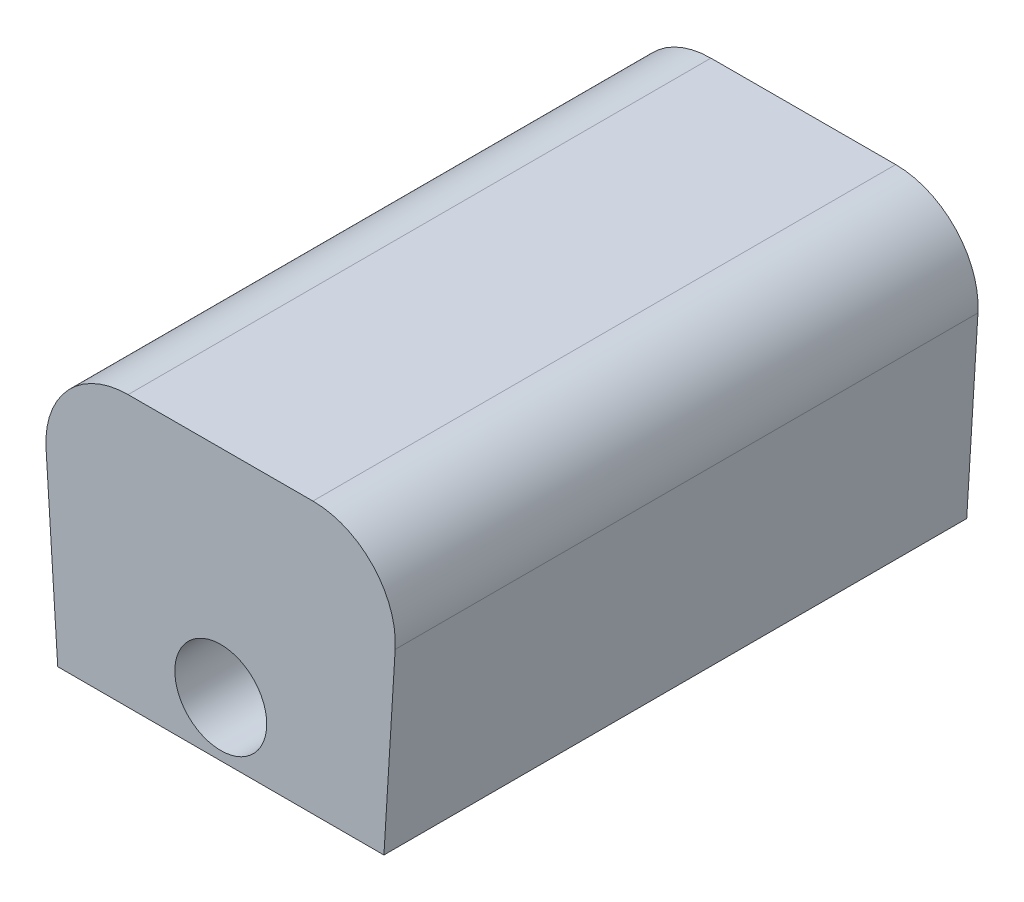
ISO-10303-21;
HEADER;
FILE_DESCRIPTION(('STEP AP214'),'2;1');
FILE_NAME('part.step','',(''),(''),'','','');
FILE_SCHEMA(('AUTOMOTIVE_DESIGN { 1 0 10303 214 1 1 1 1 }'));
ENDSEC;
DATA;
#1=APPLICATION_CONTEXT('core data for automotive mechanical design processes');
#2=APPLICATION_PROTOCOL_DEFINITION('international standard','automotive_design',2000,#1);
#3=PRODUCT_CONTEXT('',#1,'mechanical');
#4=PRODUCT('Part','Part','',(#3));
#5=PRODUCT_RELATED_PRODUCT_CATEGORY('part','',(#4));
#6=PRODUCT_DEFINITION_FORMATION('','',#4);
#7=PRODUCT_DEFINITION_CONTEXT('part definition',#1,'design');
#8=PRODUCT_DEFINITION('design','',#6,#7);
#9=PRODUCT_DEFINITION_SHAPE('','',#8);
#10=(LENGTH_UNIT() NAMED_UNIT(*) SI_UNIT(.MILLI.,.METRE.));
#11=(NAMED_UNIT(*) PLANE_ANGLE_UNIT() SI_UNIT($,.RADIAN.));
#12=(NAMED_UNIT(*) SI_UNIT($,.STERADIAN.) SOLID_ANGLE_UNIT());
#13=UNCERTAINTY_MEASURE_WITH_UNIT(LENGTH_MEASURE(1.E-05),#10,'distance_accuracy_value','');
#14=(GEOMETRIC_REPRESENTATION_CONTEXT(3) GLOBAL_UNCERTAINTY_ASSIGNED_CONTEXT((#13)) GLOBAL_UNIT_ASSIGNED_CONTEXT((#10,
#11,#12)) REPRESENTATION_CONTEXT('',''));
#15=CARTESIAN_POINT('',(0.,0.,0.));
#16=DIRECTION('',(0.,0.,1.));
#17=DIRECTION('',(1.,0.,0.));
#18=AXIS2_PLACEMENT_3D('',#15,#16,#17);
#19=CARTESIAN_POINT('',(-20.5939013463373,13.0074524571815,26.9748));
#20=DIRECTION('',(0.,0.,1.));
#21=DIRECTION('',(1.,0.,0.));
#22=AXIS2_PLACEMENT_3D('',#19,#20,#21);
#23=PLANE('',#22);
#24=DIRECTION('',(-1.,0.,0.));
#25=VECTOR('',#24,1.);
#26=CARTESIAN_POINT('',(-34.6351943560014,32.0560734353228,26.9748));
#27=LINE('',#26,#25);
#28=CARTESIAN_POINT('',(-13.0693880709597,32.0560734353228,26.9748));
#29=VERTEX_POINT('',#28);
#30=CARTESIAN_POINT('',(-28.1669222652994,32.0560734353228,26.9748));
#31=VERTEX_POINT('',#30);
#32=EDGE_CURVE('E55',#29,#31,#27,.T.);
#33=ORIENTED_EDGE('',*,*,#32,.F.);
#34=DIRECTION('',(0.0611381739078937,0.998129312109011,0.));
#35=VECTOR('',#34,1.);
#36=CARTESIAN_POINT('',(-14.2437428066184,12.8837984138138,26.9748));
#37=LINE('',#36,#35);
#38=CARTESIAN_POINT('',(-12.5485319114021,40.5594644759219,26.9748));
#39=VERTEX_POINT('',#38);
#40=EDGE_CURVE('E90',#29,#39,#37,.T.);
#41=ORIENTED_EDGE('',*,*,#40,.T.);
#42=CARTESIAN_POINT('',(-16.3514045905375,40.792400918511,26.9748));
#43=DIRECTION('',(0.,0.,1.));
#44=DIRECTION('',(1.,0.,0.));
#45=AXIS2_PLACEMENT_3D('',#42,#43,#44);
#46=CIRCLE('',#45,3.81);
#47=CARTESIAN_POINT('',(-16.3561384535796,44.6023979776359,26.9748));
#48=VERTEX_POINT('',#47);
#49=EDGE_CURVE('E116',#39,#48,#46,.T.);
#50=ORIENTED_EDGE('',*,*,#49,.T.);
#51=DIRECTION('',(-0.999999228116782,-0.00124248373809945,0.));
#52=VECTOR('',#51,1.);
#53=CARTESIAN_POINT('',(-16.3561384535796,44.6023979776359,26.9748));
#54=LINE('',#53,#52);
#55=CARTESIAN_POINT('',(-24.910163506296,44.5917697324088,26.9748));
#56=VERTEX_POINT('',#55);
#57=EDGE_CURVE('E121',#48,#56,#54,.T.);
#58=ORIENTED_EDGE('',*,*,#57,.T.);
#59=CARTESIAN_POINT('',(-24.9054296432539,40.7817726732839,26.9748));
#60=DIRECTION('',(0.,0.,1.));
#61=DIRECTION('',(1.,0.,0.));
#62=AXIS2_PLACEMENT_3D('',#59,#60,#61);
#63=CIRCLE('',#62,3.81);
#64=CARTESIAN_POINT('',(-28.7077117418623,40.539386942264,26.9748));
#65=VERTEX_POINT('',#64);
#66=EDGE_CURVE('E63',#56,#65,#63,.T.);
#67=ORIENTED_EDGE('',*,*,#66,.T.);
#68=DIRECTION('',(0.0636183021049628,-0.997974304096695,0.));
#69=VECTOR('',#68,1.);
#70=CARTESIAN_POINT('',(-28.7077117418623,40.539386942264,26.9748));
#71=LINE('',#70,#69);
#72=EDGE_CURVE('E110',#65,#31,#71,.T.);
#73=ORIENTED_EDGE('',*,*,#72,.T.);
#74=EDGE_LOOP('',(#33,#41,#50,#58,#67,#73));
#75=FACE_BOUND('',#74,.T.);
#76=CARTESIAN_POINT('',(-20.6207248775353,34.5960734353228,26.9748));
#77=DIRECTION('',(0.,0.,1.));
#78=DIRECTION('',(1.,0.,0.));
#79=AXIS2_PLACEMENT_3D('',#76,#77,#78);
#80=CIRCLE('',#79,2.127);
#81=CARTESIAN_POINT('',(-18.4937248775353,34.5960734353228,26.9748));
#82=VERTEX_POINT('',#81);
#83=EDGE_CURVE('E139',#82,#82,#80,.T.);
#84=ORIENTED_EDGE('',*,*,#83,.F.);
#85=EDGE_LOOP('',(#84));
#86=FACE_BOUND('',#85,.T.);
#87=ADVANCED_FACE('F39',(#75,#86),#23,.T.);
#88=CARTESIAN_POINT('',(-20.5939013463373,13.0074524571815,0.));
#89=DIRECTION('',(0.,0.,1.));
#90=DIRECTION('',(1.,0.,0.));
#91=AXIS2_PLACEMENT_3D('',#88,#89,#90);
#92=PLANE('',#91);
#93=DIRECTION('',(0.0611381739078937,0.998129312109011,0.));
#94=VECTOR('',#93,1.);
#95=CARTESIAN_POINT('',(-14.2437428066184,12.8837984138138,0.));
#96=LINE('',#95,#94);
#97=CARTESIAN_POINT('',(-13.0693880709597,32.0560734353228,0.));
#98=VERTEX_POINT('',#97);
#99=CARTESIAN_POINT('',(-12.5485319114021,40.5594644759219,0.));
#100=VERTEX_POINT('',#99);
#101=EDGE_CURVE('E135',#98,#100,#96,.T.);
#102=ORIENTED_EDGE('',*,*,#101,.F.);
#103=DIRECTION('',(-1.,0.,0.));
#104=VECTOR('',#103,1.);
#105=CARTESIAN_POINT('',(-34.6351943560014,32.0560734353228,0.));
#106=LINE('',#105,#104);
#107=CARTESIAN_POINT('',(-28.1669222652994,32.0560734353228,0.));
#108=VERTEX_POINT('',#107);
#109=EDGE_CURVE('E102',#98,#108,#106,.T.);
#110=ORIENTED_EDGE('',*,*,#109,.T.);
#111=DIRECTION('',(0.0636183021049628,-0.997974304096695,0.));
#112=VECTOR('',#111,1.);
#113=CARTESIAN_POINT('',(-28.7077117418623,40.539386942264,0.));
#114=LINE('',#113,#112);
#115=CARTESIAN_POINT('',(-28.7077117418623,40.539386942264,0.));
#116=VERTEX_POINT('',#115);
#117=EDGE_CURVE('E117',#116,#108,#114,.T.);
#118=ORIENTED_EDGE('',*,*,#117,.F.);
#119=CARTESIAN_POINT('',(-24.9054296432539,40.7817726732839,0.));
#120=DIRECTION('',(0.,0.,1.));
#121=DIRECTION('',(1.,0.,0.));
#122=AXIS2_PLACEMENT_3D('',#119,#120,#121);
#123=CIRCLE('',#122,3.81);
#124=CARTESIAN_POINT('',(-24.910163506296,44.5917697324088,0.));
#125=VERTEX_POINT('',#124);
#126=EDGE_CURVE('E84',#125,#116,#123,.T.);
#127=ORIENTED_EDGE('',*,*,#126,.F.);
#128=DIRECTION('',(-0.999999228116782,-0.00124248373809945,0.));
#129=VECTOR('',#128,1.);
#130=CARTESIAN_POINT('',(-16.3561384535796,44.6023979776359,0.));
#131=LINE('',#130,#129);
#132=CARTESIAN_POINT('',(-16.3561384535796,44.6023979776359,0.));
#133=VERTEX_POINT('',#132);
#134=EDGE_CURVE('E142',#133,#125,#131,.T.);
#135=ORIENTED_EDGE('',*,*,#134,.F.);
#136=CARTESIAN_POINT('',(-16.3514045905375,40.792400918511,0.));
#137=DIRECTION('',(0.,0.,1.));
#138=DIRECTION('',(1.,0.,0.));
#139=AXIS2_PLACEMENT_3D('',#136,#137,#138);
#140=CIRCLE('',#139,3.81);
#141=EDGE_CURVE('E138',#100,#133,#140,.T.);
#142=ORIENTED_EDGE('',*,*,#141,.F.);
#143=EDGE_LOOP('',(#102,#110,#118,#127,#135,#142));
#144=FACE_BOUND('',#143,.T.);
#145=CARTESIAN_POINT('',(-20.6207248775353,34.5960734353228,0.));
#146=DIRECTION('',(0.,0.,1.));
#147=DIRECTION('',(1.,0.,0.));
#148=AXIS2_PLACEMENT_3D('',#145,#146,#147);
#149=CIRCLE('',#148,2.127);
#150=CARTESIAN_POINT('',(-18.4937248775353,34.5960734353228,0.));
#151=VERTEX_POINT('',#150);
#152=EDGE_CURVE('E106',#151,#151,#149,.T.);
#153=ORIENTED_EDGE('',*,*,#152,.T.);
#154=EDGE_LOOP('',(#153));
#155=FACE_BOUND('',#154,.T.);
#156=ADVANCED_FACE('F162',(#144,#155),#92,.F.);
#157=CARTESIAN_POINT('',(-14.2437428066184,12.8837984138138,26.9748));
#158=DIRECTION('',(-0.998129312109011,0.0611381739078937,0.));
#159=DIRECTION('',(-0.0611381739078937,-0.998129312109011,0.));
#160=AXIS2_PLACEMENT_3D('',#157,#158,#159);
#161=PLANE('',#160);
#162=ORIENTED_EDGE('',*,*,#40,.F.);
#163=DIRECTION('',(0.,0.,-1.));
#164=VECTOR('',#163,1.);
#165=CARTESIAN_POINT('',(-13.0693880709597,32.0560734353228,26.9748));
#166=LINE('',#165,#164);
#167=EDGE_CURVE('E99',#29,#98,#166,.T.);
#168=ORIENTED_EDGE('',*,*,#167,.T.);
#169=ORIENTED_EDGE('',*,*,#101,.T.);
#170=DIRECTION('',(0.,0.,-1.));
#171=VECTOR('',#170,1.);
#172=CARTESIAN_POINT('',(-12.5485319114021,40.5594644759219,26.9748));
#173=LINE('',#172,#171);
#174=EDGE_CURVE('E48',#39,#100,#173,.T.);
#175=ORIENTED_EDGE('',*,*,#174,.F.);
#176=EDGE_LOOP('',(#162,#168,#169,#175));
#177=FACE_BOUND('',#176,.T.);
#178=ADVANCED_FACE('F41',(#177),#161,.F.);
#179=CARTESIAN_POINT('',(-16.3514045905375,40.792400918511,26.9748));
#180=DIRECTION('',(0.,0.,-1.));
#181=DIRECTION('',(-1.,0.,0.));
#182=AXIS2_PLACEMENT_3D('',#179,#180,#181);
#183=CYLINDRICAL_SURFACE('',#182,3.81);
#184=ORIENTED_EDGE('',*,*,#141,.T.);
#185=DIRECTION('',(0.,0.,-1.));
#186=VECTOR('',#185,1.);
#187=CARTESIAN_POINT('',(-16.3561384535796,44.6023979776359,26.9748));
#188=LINE('',#187,#186);
#189=EDGE_CURVE('E152',#48,#133,#188,.T.);
#190=ORIENTED_EDGE('',*,*,#189,.F.);
#191=ORIENTED_EDGE('',*,*,#49,.F.);
#192=ORIENTED_EDGE('',*,*,#174,.T.);
#193=EDGE_LOOP('',(#184,#190,#191,#192));
#194=FACE_BOUND('',#193,.T.);
#195=ADVANCED_FACE('F158',(#194),#183,.T.);
#196=CARTESIAN_POINT('',(-16.3561384535796,44.6023979776359,26.9748));
#197=DIRECTION('',(0.00124248373809945,-0.999999228116782,0.));
#198=DIRECTION('',(0.999999228116782,0.00124248373809945,0.));
#199=AXIS2_PLACEMENT_3D('',#196,#197,#198);
#200=PLANE('',#199);
#201=ORIENTED_EDGE('',*,*,#134,.T.);
#202=DIRECTION('',(0.,0.,-1.));
#203=VECTOR('',#202,1.);
#204=CARTESIAN_POINT('',(-24.910163506296,44.5917697324088,26.9748));
#205=LINE('',#204,#203);
#206=EDGE_CURVE('E149',#56,#125,#205,.T.);
#207=ORIENTED_EDGE('',*,*,#206,.F.);
#208=ORIENTED_EDGE('',*,*,#57,.F.);
#209=ORIENTED_EDGE('',*,*,#189,.T.);
#210=EDGE_LOOP('',(#201,#207,#208,#209));
#211=FACE_BOUND('',#210,.T.);
#212=ADVANCED_FACE('F167',(#211),#200,.F.);
#213=CARTESIAN_POINT('',(-24.9054296432539,40.7817726732839,26.9748));
#214=DIRECTION('',(0.,0.,-1.));
#215=DIRECTION('',(-1.,0.,0.));
#216=AXIS2_PLACEMENT_3D('',#213,#214,#215);
#217=CYLINDRICAL_SURFACE('',#216,3.81);
#218=ORIENTED_EDGE('',*,*,#126,.T.);
#219=DIRECTION('',(0.,0.,-1.));
#220=VECTOR('',#219,1.);
#221=CARTESIAN_POINT('',(-28.7077117418623,40.539386942264,26.9748));
#222=LINE('',#221,#220);
#223=EDGE_CURVE('E134',#65,#116,#222,.T.);
#224=ORIENTED_EDGE('',*,*,#223,.F.);
#225=ORIENTED_EDGE('',*,*,#66,.F.);
#226=ORIENTED_EDGE('',*,*,#206,.T.);
#227=EDGE_LOOP('',(#218,#224,#225,#226));
#228=FACE_BOUND('',#227,.T.);
#229=ADVANCED_FACE('F169',(#228),#217,.T.);
#230=CARTESIAN_POINT('',(-28.7077117418623,40.539386942264,26.9748));
#231=DIRECTION('',(0.997974304096695,0.0636183021049628,0.));
#232=DIRECTION('',(-0.0636183021049628,0.997974304096695,0.));
#233=AXIS2_PLACEMENT_3D('',#230,#231,#232);
#234=PLANE('',#233);
#235=ORIENTED_EDGE('',*,*,#117,.T.);
#236=DIRECTION('',(0.,0.,1.));
#237=VECTOR('',#236,1.);
#238=CARTESIAN_POINT('',(-28.1669222652994,32.0560734353228,26.9748));
#239=LINE('',#238,#237);
#240=EDGE_CURVE('E11',#108,#31,#239,.T.);
#241=ORIENTED_EDGE('',*,*,#240,.T.);
#242=ORIENTED_EDGE('',*,*,#72,.F.);
#243=ORIENTED_EDGE('',*,*,#223,.T.);
#244=EDGE_LOOP('',(#235,#241,#242,#243));
#245=FACE_BOUND('',#244,.T.);
#246=ADVANCED_FACE('F171',(#245),#234,.F.);
#247=CARTESIAN_POINT('',(-20.6207248775353,34.5960734353228,26.9748));
#248=DIRECTION('',(0.,0.,-1.));
#249=DIRECTION('',(-1.,0.,0.));
#250=AXIS2_PLACEMENT_3D('',#247,#248,#249);
#251=CYLINDRICAL_SURFACE('',#250,2.127);
#252=ORIENTED_EDGE('',*,*,#83,.T.);
#253=EDGE_LOOP('',(#252));
#254=FACE_BOUND('',#253,.T.);
#255=ORIENTED_EDGE('',*,*,#152,.F.);
#256=EDGE_LOOP('',(#255));
#257=FACE_BOUND('',#256,.T.);
#258=ADVANCED_FACE('F182',(#254,#257),#251,.F.);
#259=CARTESIAN_POINT('',(-34.6351943560014,32.0560734353228,0.));
#260=DIRECTION('',(0.,1.,0.));
#261=DIRECTION('',(0.,0.,1.));
#262=AXIS2_PLACEMENT_3D('',#259,#260,#261);
#263=PLANE('',#262);
#264=ORIENTED_EDGE('',*,*,#32,.T.);
#265=ORIENTED_EDGE('',*,*,#240,.F.);
#266=ORIENTED_EDGE('',*,*,#109,.F.);
#267=ORIENTED_EDGE('',*,*,#167,.F.);
#268=EDGE_LOOP('',(#264,#265,#266,#267));
#269=FACE_BOUND('',#268,.T.);
#270=ADVANCED_FACE('F100',(#269),#263,.F.);
#271=CLOSED_SHELL('',(#87,#156,#178,#195,#212,#229,#246,#258,#270));
#272=MANIFOLD_SOLID_BREP('B2',#271);
#273=ADVANCED_BREP_SHAPE_REPRESENTATION('',(#18,#272),#14);
#274=SHAPE_DEFINITION_REPRESENTATION(#9,#273);
ENDSEC;
END-ISO-10303-21;
